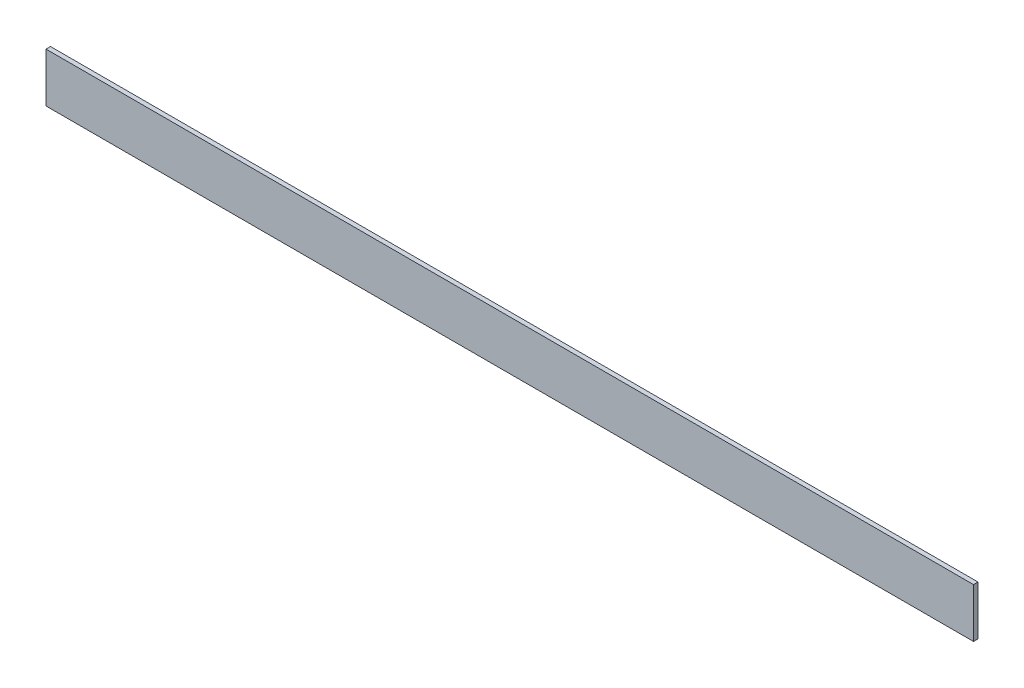
ISO-10303-21;
HEADER;
FILE_DESCRIPTION(('STEP AP214'),'2;1');
FILE_NAME('part.step','',(''),(''),'','','');
FILE_SCHEMA(('AUTOMOTIVE_DESIGN { 1 0 10303 214 1 1 1 1 }'));
ENDSEC;
DATA;
#1=APPLICATION_CONTEXT('core data for automotive mechanical design processes');
#2=APPLICATION_PROTOCOL_DEFINITION('international standard','automotive_design',2000,#1);
#3=PRODUCT_CONTEXT('',#1,'mechanical');
#4=PRODUCT('Part','Part','',(#3));
#5=PRODUCT_RELATED_PRODUCT_CATEGORY('part','',(#4));
#6=PRODUCT_DEFINITION_FORMATION('','',#4);
#7=PRODUCT_DEFINITION_CONTEXT('part definition',#1,'design');
#8=PRODUCT_DEFINITION('design','',#6,#7);
#9=PRODUCT_DEFINITION_SHAPE('','',#8);
#10=(LENGTH_UNIT() NAMED_UNIT(*) SI_UNIT(.MILLI.,.METRE.));
#11=(NAMED_UNIT(*) PLANE_ANGLE_UNIT() SI_UNIT($,.RADIAN.));
#12=(NAMED_UNIT(*) SI_UNIT($,.STERADIAN.) SOLID_ANGLE_UNIT());
#13=UNCERTAINTY_MEASURE_WITH_UNIT(LENGTH_MEASURE(1.E-05),#10,'distance_accuracy_value','');
#14=(GEOMETRIC_REPRESENTATION_CONTEXT(3) GLOBAL_UNCERTAINTY_ASSIGNED_CONTEXT((#13)) GLOBAL_UNIT_ASSIGNED_CONTEXT((#10,
#11,#12)) REPRESENTATION_CONTEXT('',''));
#15=CARTESIAN_POINT('',(0.,0.,0.));
#16=DIRECTION('',(0.,0.,1.));
#17=DIRECTION('',(1.,0.,0.));
#18=AXIS2_PLACEMENT_3D('',#15,#16,#17);
#19=CARTESIAN_POINT('',(-117.,5.5,1.));
#20=DIRECTION('',(1.,0.,0.));
#21=DIRECTION('',(0.,0.,-1.));
#22=AXIS2_PLACEMENT_3D('',#19,#20,#21);
#23=PLANE('',#22);
#24=DIRECTION('',(0.,-1.,0.));
#25=VECTOR('',#24,1.);
#26=CARTESIAN_POINT('',(-117.,5.5,0.));
#27=LINE('',#26,#25);
#28=CARTESIAN_POINT('',(-117.,5.5,0.));
#29=VERTEX_POINT('',#28);
#30=CARTESIAN_POINT('',(-117.,-5.5,0.));
#31=VERTEX_POINT('',#30);
#32=EDGE_CURVE('E114',#29,#31,#27,.T.);
#33=ORIENTED_EDGE('',*,*,#32,.T.);
#34=DIRECTION('',(0.,0.,-1.));
#35=VECTOR('',#34,1.);
#36=CARTESIAN_POINT('',(-117.,-5.5,1.));
#37=LINE('',#36,#35);
#38=CARTESIAN_POINT('',(-117.,-5.5,1.));
#39=VERTEX_POINT('',#38);
#40=EDGE_CURVE('E11',#39,#31,#37,.T.);
#41=ORIENTED_EDGE('',*,*,#40,.F.);
#42=DIRECTION('',(0.,-1.,0.));
#43=VECTOR('',#42,1.);
#44=CARTESIAN_POINT('',(-117.,5.5,1.));
#45=LINE('',#44,#43);
#46=CARTESIAN_POINT('',(-117.,5.5,1.));
#47=VERTEX_POINT('',#46);
#48=EDGE_CURVE('E97',#47,#39,#45,.T.);
#49=ORIENTED_EDGE('',*,*,#48,.F.);
#50=DIRECTION('',(0.,0.,-1.));
#51=VECTOR('',#50,1.);
#52=CARTESIAN_POINT('',(-117.,5.5,1.));
#53=LINE('',#52,#51);
#54=EDGE_CURVE('E110',#47,#29,#53,.T.);
#55=ORIENTED_EDGE('',*,*,#54,.T.);
#56=EDGE_LOOP('',(#33,#41,#49,#55));
#57=FACE_BOUND('',#56,.T.);
#58=ADVANCED_FACE('F45',(#57),#23,.F.);
#59=CARTESIAN_POINT('',(-117.,-5.5,1.));
#60=DIRECTION('',(0.,1.,0.));
#61=DIRECTION('',(0.,0.,1.));
#62=AXIS2_PLACEMENT_3D('',#59,#60,#61);
#63=PLANE('',#62);
#64=DIRECTION('',(1.,0.,0.));
#65=VECTOR('',#64,1.);
#66=CARTESIAN_POINT('',(-117.,-5.5,0.));
#67=LINE('',#66,#65);
#68=CARTESIAN_POINT('',(90.,-5.5,0.));
#69=VERTEX_POINT('',#68);
#70=EDGE_CURVE('E102',#31,#69,#67,.T.);
#71=ORIENTED_EDGE('',*,*,#70,.T.);
#72=DIRECTION('',(0.,0.,-1.));
#73=VECTOR('',#72,1.);
#74=CARTESIAN_POINT('',(90.,-5.5,1.));
#75=LINE('',#74,#73);
#76=CARTESIAN_POINT('',(90.,-5.5,1.));
#77=VERTEX_POINT('',#76);
#78=EDGE_CURVE('E54',#77,#69,#75,.T.);
#79=ORIENTED_EDGE('',*,*,#78,.F.);
#80=DIRECTION('',(1.,0.,0.));
#81=VECTOR('',#80,1.);
#82=CARTESIAN_POINT('',(-117.,-5.5,1.));
#83=LINE('',#82,#81);
#84=EDGE_CURVE('E92',#39,#77,#83,.T.);
#85=ORIENTED_EDGE('',*,*,#84,.F.);
#86=ORIENTED_EDGE('',*,*,#40,.T.);
#87=EDGE_LOOP('',(#71,#79,#85,#86));
#88=FACE_BOUND('',#87,.T.);
#89=ADVANCED_FACE('F101',(#88),#63,.F.);
#90=CARTESIAN_POINT('',(90.,-5.5,1.));
#91=DIRECTION('',(-1.,0.,0.));
#92=DIRECTION('',(0.,0.,1.));
#93=AXIS2_PLACEMENT_3D('',#90,#91,#92);
#94=PLANE('',#93);
#95=DIRECTION('',(0.,1.,0.));
#96=VECTOR('',#95,1.);
#97=CARTESIAN_POINT('',(90.,-5.5,0.));
#98=LINE('',#97,#96);
#99=CARTESIAN_POINT('',(90.,5.5,0.));
#100=VERTEX_POINT('',#99);
#101=EDGE_CURVE('E79',#69,#100,#98,.T.);
#102=ORIENTED_EDGE('',*,*,#101,.T.);
#103=DIRECTION('',(0.,0.,-1.));
#104=VECTOR('',#103,1.);
#105=CARTESIAN_POINT('',(90.,5.5,1.));
#106=LINE('',#105,#104);
#107=CARTESIAN_POINT('',(90.,5.5,1.));
#108=VERTEX_POINT('',#107);
#109=EDGE_CURVE('E104',#108,#100,#106,.T.);
#110=ORIENTED_EDGE('',*,*,#109,.F.);
#111=DIRECTION('',(0.,1.,0.));
#112=VECTOR('',#111,1.);
#113=CARTESIAN_POINT('',(90.,-5.5,1.));
#114=LINE('',#113,#112);
#115=EDGE_CURVE('E95',#77,#108,#114,.T.);
#116=ORIENTED_EDGE('',*,*,#115,.F.);
#117=ORIENTED_EDGE('',*,*,#78,.T.);
#118=EDGE_LOOP('',(#102,#110,#116,#117));
#119=FACE_BOUND('',#118,.T.);
#120=ADVANCED_FACE('F105',(#119),#94,.F.);
#121=CARTESIAN_POINT('',(90.,5.5,1.));
#122=DIRECTION('',(0.,-1.,0.));
#123=DIRECTION('',(0.,0.,-1.));
#124=AXIS2_PLACEMENT_3D('',#121,#122,#123);
#125=PLANE('',#124);
#126=DIRECTION('',(-1.,0.,0.));
#127=VECTOR('',#126,1.);
#128=CARTESIAN_POINT('',(90.,5.5,0.));
#129=LINE('',#128,#127);
#130=EDGE_CURVE('E85',#100,#29,#129,.T.);
#131=ORIENTED_EDGE('',*,*,#130,.T.);
#132=ORIENTED_EDGE('',*,*,#54,.F.);
#133=DIRECTION('',(-1.,0.,0.));
#134=VECTOR('',#133,1.);
#135=CARTESIAN_POINT('',(90.,5.5,1.));
#136=LINE('',#135,#134);
#137=EDGE_CURVE('E62',#108,#47,#136,.T.);
#138=ORIENTED_EDGE('',*,*,#137,.F.);
#139=ORIENTED_EDGE('',*,*,#109,.T.);
#140=EDGE_LOOP('',(#131,#132,#138,#139));
#141=FACE_BOUND('',#140,.T.);
#142=ADVANCED_FACE('F126',(#141),#125,.F.);
#143=CARTESIAN_POINT('',(0.,0.,1.));
#144=DIRECTION('',(0.,0.,1.));
#145=DIRECTION('',(1.,0.,0.));
#146=AXIS2_PLACEMENT_3D('',#143,#144,#145);
#147=PLANE('',#146);
#148=ORIENTED_EDGE('',*,*,#48,.T.);
#149=ORIENTED_EDGE('',*,*,#84,.T.);
#150=ORIENTED_EDGE('',*,*,#115,.T.);
#151=ORIENTED_EDGE('',*,*,#137,.T.);
#152=EDGE_LOOP('',(#148,#149,#150,#151));
#153=FACE_BOUND('',#152,.T.);
#154=ADVANCED_FACE('F93',(#153),#147,.T.);
#155=CARTESIAN_POINT('',(0.,0.,0.));
#156=DIRECTION('',(0.,0.,1.));
#157=DIRECTION('',(1.,0.,0.));
#158=AXIS2_PLACEMENT_3D('',#155,#156,#157);
#159=PLANE('',#158);
#160=ORIENTED_EDGE('',*,*,#32,.F.);
#161=ORIENTED_EDGE('',*,*,#130,.F.);
#162=ORIENTED_EDGE('',*,*,#101,.F.);
#163=ORIENTED_EDGE('',*,*,#70,.F.);
#164=EDGE_LOOP('',(#160,#161,#162,#163));
#165=FACE_BOUND('',#164,.T.);
#166=ADVANCED_FACE('F129',(#165),#159,.F.);
#167=CLOSED_SHELL('',(#58,#89,#120,#142,#154,#166));
#168=MANIFOLD_SOLID_BREP('B2',#167);
#169=ADVANCED_BREP_SHAPE_REPRESENTATION('',(#18,#168),#14);
#170=SHAPE_DEFINITION_REPRESENTATION(#9,#169);
ENDSEC;
END-ISO-10303-21;
